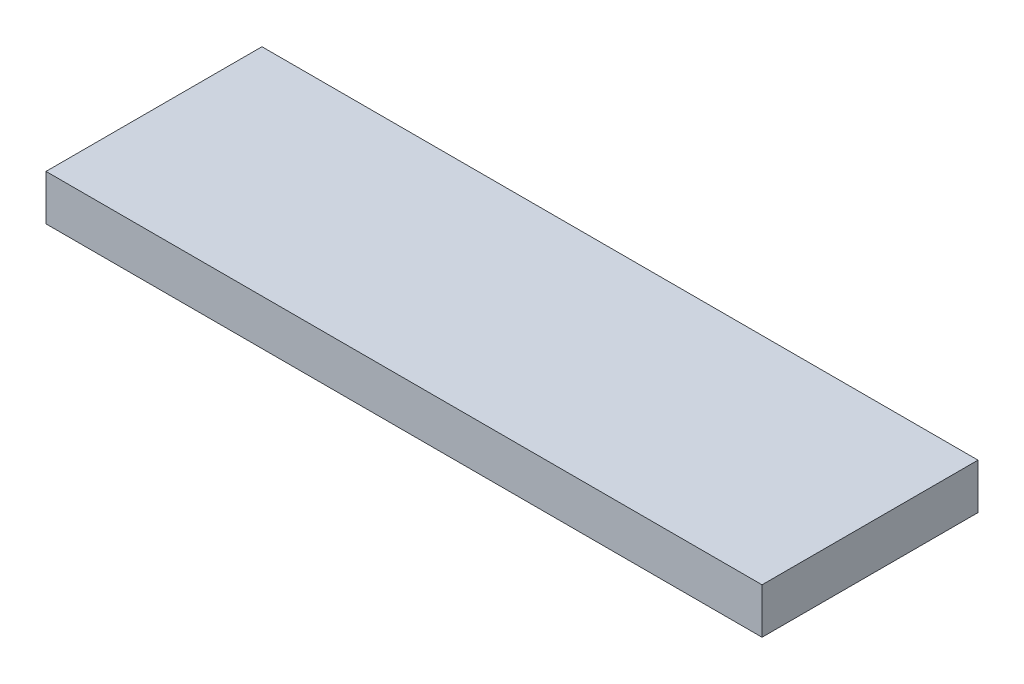
ISO-10303-21;
HEADER;
FILE_DESCRIPTION(('STEP AP214'),'2;1');
FILE_NAME('part.step','',(''),(''),'','','');
FILE_SCHEMA(('AUTOMOTIVE_DESIGN { 1 0 10303 214 1 1 1 1 }'));
ENDSEC;
DATA;
#1=APPLICATION_CONTEXT('core data for automotive mechanical design processes');
#2=APPLICATION_PROTOCOL_DEFINITION('international standard','automotive_design',2000,#1);
#3=PRODUCT_CONTEXT('',#1,'mechanical');
#4=PRODUCT('Part','Part','',(#3));
#5=PRODUCT_RELATED_PRODUCT_CATEGORY('part','',(#4));
#6=PRODUCT_DEFINITION_FORMATION('','',#4);
#7=PRODUCT_DEFINITION_CONTEXT('part definition',#1,'design');
#8=PRODUCT_DEFINITION('design','',#6,#7);
#9=PRODUCT_DEFINITION_SHAPE('','',#8);
#10=(LENGTH_UNIT() NAMED_UNIT(*) SI_UNIT(.MILLI.,.METRE.));
#11=(NAMED_UNIT(*) PLANE_ANGLE_UNIT() SI_UNIT($,.RADIAN.));
#12=(NAMED_UNIT(*) SI_UNIT($,.STERADIAN.) SOLID_ANGLE_UNIT());
#13=UNCERTAINTY_MEASURE_WITH_UNIT(LENGTH_MEASURE(1.E-05),#10,'distance_accuracy_value','');
#14=(GEOMETRIC_REPRESENTATION_CONTEXT(3) GLOBAL_UNCERTAINTY_ASSIGNED_CONTEXT((#13)) GLOBAL_UNIT_ASSIGNED_CONTEXT((#10,
#11,#12)) REPRESENTATION_CONTEXT('',''));
#15=CARTESIAN_POINT('',(0.,0.,0.));
#16=DIRECTION('',(0.,0.,1.));
#17=DIRECTION('',(1.,0.,0.));
#18=AXIS2_PLACEMENT_3D('',#15,#16,#17);
#19=CARTESIAN_POINT('',(31.5,4.,9.5));
#20=DIRECTION('',(-1.,0.,0.));
#21=DIRECTION('',(0.,0.,1.));
#22=AXIS2_PLACEMENT_3D('',#19,#20,#21);
#23=PLANE('',#22);
#24=DIRECTION('',(0.,0.,-1.));
#25=VECTOR('',#24,1.);
#26=CARTESIAN_POINT('',(31.5,0.,9.5));
#27=LINE('',#26,#25);
#28=CARTESIAN_POINT('',(31.5,0.,9.5));
#29=VERTEX_POINT('',#28);
#30=CARTESIAN_POINT('',(31.5,0.,-9.5));
#31=VERTEX_POINT('',#30);
#32=EDGE_CURVE('E97',#29,#31,#27,.T.);
#33=ORIENTED_EDGE('',*,*,#32,.T.);
#34=DIRECTION('',(0.,-1.,0.));
#35=VECTOR('',#34,1.);
#36=CARTESIAN_POINT('',(31.5,4.,-9.5));
#37=LINE('',#36,#35);
#38=CARTESIAN_POINT('',(31.5,4.,-9.5));
#39=VERTEX_POINT('',#38);
#40=EDGE_CURVE('E11',#39,#31,#37,.T.);
#41=ORIENTED_EDGE('',*,*,#40,.F.);
#42=DIRECTION('',(0.,0.,-1.));
#43=VECTOR('',#42,1.);
#44=CARTESIAN_POINT('',(31.5,4.,9.5));
#45=LINE('',#44,#43);
#46=CARTESIAN_POINT('',(31.5,4.,9.5));
#47=VERTEX_POINT('',#46);
#48=EDGE_CURVE('E85',#47,#39,#45,.T.);
#49=ORIENTED_EDGE('',*,*,#48,.F.);
#50=DIRECTION('',(0.,-1.,0.));
#51=VECTOR('',#50,1.);
#52=CARTESIAN_POINT('',(31.5,4.,9.5));
#53=LINE('',#52,#51);
#54=EDGE_CURVE('E93',#47,#29,#53,.T.);
#55=ORIENTED_EDGE('',*,*,#54,.T.);
#56=EDGE_LOOP('',(#33,#41,#49,#55));
#57=FACE_BOUND('',#56,.T.);
#58=ADVANCED_FACE('F34',(#57),#23,.F.);
#59=CARTESIAN_POINT('',(-31.5,4.,-9.5));
#60=DIRECTION('',(0.,0.,1.));
#61=DIRECTION('',(1.,0.,0.));
#62=AXIS2_PLACEMENT_3D('',#59,#60,#61);
#63=PLANE('',#62);
#64=DIRECTION('',(-1.,0.,0.));
#65=VECTOR('',#64,1.);
#66=CARTESIAN_POINT('',(-31.5,0.,-9.5));
#67=LINE('',#66,#65);
#68=CARTESIAN_POINT('',(-31.5,0.,-9.5));
#69=VERTEX_POINT('',#68);
#70=EDGE_CURVE('E89',#31,#69,#67,.T.);
#71=ORIENTED_EDGE('',*,*,#70,.T.);
#72=DIRECTION('',(0.,-1.,0.));
#73=VECTOR('',#72,1.);
#74=CARTESIAN_POINT('',(-31.5,4.,-9.5));
#75=LINE('',#74,#73);
#76=CARTESIAN_POINT('',(-31.5,4.,-9.5));
#77=VERTEX_POINT('',#76);
#78=EDGE_CURVE('E42',#77,#69,#75,.T.);
#79=ORIENTED_EDGE('',*,*,#78,.F.);
#80=DIRECTION('',(-1.,0.,0.));
#81=VECTOR('',#80,1.);
#82=CARTESIAN_POINT('',(-31.5,4.,-9.5));
#83=LINE('',#82,#81);
#84=EDGE_CURVE('E80',#39,#77,#83,.T.);
#85=ORIENTED_EDGE('',*,*,#84,.F.);
#86=ORIENTED_EDGE('',*,*,#40,.T.);
#87=EDGE_LOOP('',(#71,#79,#85,#86));
#88=FACE_BOUND('',#87,.T.);
#89=ADVANCED_FACE('F88',(#88),#63,.F.);
#90=CARTESIAN_POINT('',(-31.5,4.,9.5));
#91=DIRECTION('',(1.,0.,0.));
#92=DIRECTION('',(0.,0.,-1.));
#93=AXIS2_PLACEMENT_3D('',#90,#91,#92);
#94=PLANE('',#93);
#95=DIRECTION('',(0.,0.,1.));
#96=VECTOR('',#95,1.);
#97=CARTESIAN_POINT('',(-31.5,0.,9.5));
#98=LINE('',#97,#96);
#99=CARTESIAN_POINT('',(-31.5,0.,9.5));
#100=VERTEX_POINT('',#99);
#101=EDGE_CURVE('E67',#69,#100,#98,.T.);
#102=ORIENTED_EDGE('',*,*,#101,.T.);
#103=DIRECTION('',(0.,-1.,0.));
#104=VECTOR('',#103,1.);
#105=CARTESIAN_POINT('',(-31.5,4.,9.5));
#106=LINE('',#105,#104);
#107=CARTESIAN_POINT('',(-31.5,4.,9.5));
#108=VERTEX_POINT('',#107);
#109=EDGE_CURVE('E90',#108,#100,#106,.T.);
#110=ORIENTED_EDGE('',*,*,#109,.F.);
#111=DIRECTION('',(0.,0.,1.));
#112=VECTOR('',#111,1.);
#113=CARTESIAN_POINT('',(-31.5,4.,9.5));
#114=LINE('',#113,#112);
#115=EDGE_CURVE('E83',#77,#108,#114,.T.);
#116=ORIENTED_EDGE('',*,*,#115,.F.);
#117=ORIENTED_EDGE('',*,*,#78,.T.);
#118=EDGE_LOOP('',(#102,#110,#116,#117));
#119=FACE_BOUND('',#118,.T.);
#120=ADVANCED_FACE('F91',(#119),#94,.F.);
#121=CARTESIAN_POINT('',(-31.5,4.,9.5));
#122=DIRECTION('',(0.,0.,-1.));
#123=DIRECTION('',(-1.,0.,0.));
#124=AXIS2_PLACEMENT_3D('',#121,#122,#123);
#125=PLANE('',#124);
#126=DIRECTION('',(1.,0.,0.));
#127=VECTOR('',#126,1.);
#128=CARTESIAN_POINT('',(-31.5,0.,9.5));
#129=LINE('',#128,#127);
#130=EDGE_CURVE('E73',#100,#29,#129,.T.);
#131=ORIENTED_EDGE('',*,*,#130,.T.);
#132=ORIENTED_EDGE('',*,*,#54,.F.);
#133=DIRECTION('',(1.,0.,0.));
#134=VECTOR('',#133,1.);
#135=CARTESIAN_POINT('',(-31.5,4.,9.5));
#136=LINE('',#135,#134);
#137=EDGE_CURVE('E50',#108,#47,#136,.T.);
#138=ORIENTED_EDGE('',*,*,#137,.F.);
#139=ORIENTED_EDGE('',*,*,#109,.T.);
#140=EDGE_LOOP('',(#131,#132,#138,#139));
#141=FACE_BOUND('',#140,.T.);
#142=ADVANCED_FACE('F104',(#141),#125,.F.);
#143=CARTESIAN_POINT('',(0.,4.,0.));
#144=DIRECTION('',(0.,-1.,0.));
#145=DIRECTION('',(0.,0.,-1.));
#146=AXIS2_PLACEMENT_3D('',#143,#144,#145);
#147=PLANE('',#146);
#148=ORIENTED_EDGE('',*,*,#48,.T.);
#149=ORIENTED_EDGE('',*,*,#84,.T.);
#150=ORIENTED_EDGE('',*,*,#115,.T.);
#151=ORIENTED_EDGE('',*,*,#137,.T.);
#152=EDGE_LOOP('',(#148,#149,#150,#151));
#153=FACE_BOUND('',#152,.T.);
#154=ADVANCED_FACE('F81',(#153),#147,.F.);
#155=CARTESIAN_POINT('',(0.,0.,0.));
#156=DIRECTION('',(0.,-1.,0.));
#157=DIRECTION('',(0.,0.,-1.));
#158=AXIS2_PLACEMENT_3D('',#155,#156,#157);
#159=PLANE('',#158);
#160=ORIENTED_EDGE('',*,*,#32,.F.);
#161=ORIENTED_EDGE('',*,*,#130,.F.);
#162=ORIENTED_EDGE('',*,*,#101,.F.);
#163=ORIENTED_EDGE('',*,*,#70,.F.);
#164=EDGE_LOOP('',(#160,#161,#162,#163));
#165=FACE_BOUND('',#164,.T.);
#166=ADVANCED_FACE('F107',(#165),#159,.T.);
#167=CLOSED_SHELL('',(#58,#89,#120,#142,#154,#166));
#168=MANIFOLD_SOLID_BREP('B2',#167);
#169=ADVANCED_BREP_SHAPE_REPRESENTATION('',(#18,#168),#14);
#170=SHAPE_DEFINITION_REPRESENTATION(#9,#169);
ENDSEC;
END-ISO-10303-21;
